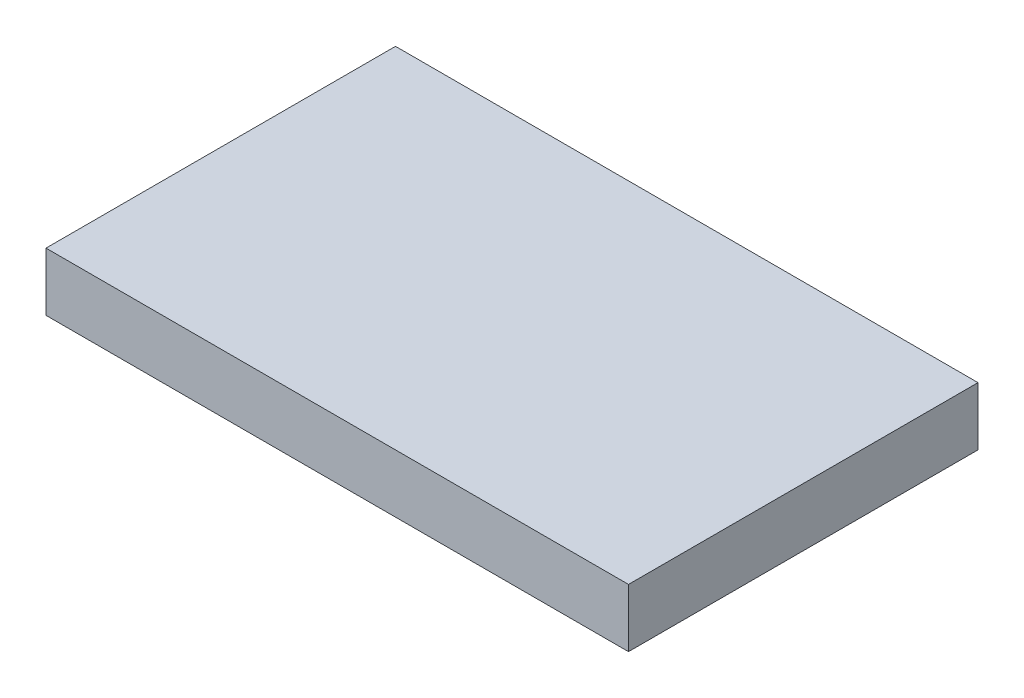
ISO-10303-21;
HEADER;
FILE_DESCRIPTION(('STEP AP214'),'2;1');
FILE_NAME('part.step','',(''),(''),'','','');
FILE_SCHEMA(('AUTOMOTIVE_DESIGN { 1 0 10303 214 1 1 1 1 }'));
ENDSEC;
DATA;
#1=APPLICATION_CONTEXT('core data for automotive mechanical design processes');
#2=APPLICATION_PROTOCOL_DEFINITION('international standard','automotive_design',2000,#1);
#3=PRODUCT_CONTEXT('',#1,'mechanical');
#4=PRODUCT('Part','Part','',(#3));
#5=PRODUCT_RELATED_PRODUCT_CATEGORY('part','',(#4));
#6=PRODUCT_DEFINITION_FORMATION('','',#4);
#7=PRODUCT_DEFINITION_CONTEXT('part definition',#1,'design');
#8=PRODUCT_DEFINITION('design','',#6,#7);
#9=PRODUCT_DEFINITION_SHAPE('','',#8);
#10=(LENGTH_UNIT() NAMED_UNIT(*) SI_UNIT(.MILLI.,.METRE.));
#11=(NAMED_UNIT(*) PLANE_ANGLE_UNIT() SI_UNIT($,.RADIAN.));
#12=(NAMED_UNIT(*) SI_UNIT($,.STERADIAN.) SOLID_ANGLE_UNIT());
#13=UNCERTAINTY_MEASURE_WITH_UNIT(LENGTH_MEASURE(1.E-05),#10,'distance_accuracy_value','');
#14=(GEOMETRIC_REPRESENTATION_CONTEXT(3) GLOBAL_UNCERTAINTY_ASSIGNED_CONTEXT((#13)) GLOBAL_UNIT_ASSIGNED_CONTEXT((#10,
#11,#12)) REPRESENTATION_CONTEXT('',''));
#15=CARTESIAN_POINT('',(0.,0.,0.));
#16=DIRECTION('',(0.,0.,1.));
#17=DIRECTION('',(1.,0.,0.));
#18=AXIS2_PLACEMENT_3D('',#15,#16,#17);
#19=CARTESIAN_POINT('',(0.,2.,0.));
#20=DIRECTION('',(1.,0.,0.));
#21=DIRECTION('',(0.,0.,-1.));
#22=AXIS2_PLACEMENT_3D('',#19,#20,#21);
#23=PLANE('',#22);
#24=DIRECTION('',(0.,0.,1.));
#25=VECTOR('',#24,1.);
#26=CARTESIAN_POINT('',(0.,0.,0.));
#27=LINE('',#26,#25);
#28=CARTESIAN_POINT('',(0.,0.,0.));
#29=VERTEX_POINT('',#28);
#30=CARTESIAN_POINT('',(0.,0.,12.));
#31=VERTEX_POINT('',#30);
#32=EDGE_CURVE('E107',#29,#31,#27,.T.);
#33=ORIENTED_EDGE('',*,*,#32,.T.);
#34=DIRECTION('',(0.,-1.,0.));
#35=VECTOR('',#34,1.);
#36=CARTESIAN_POINT('',(0.,2.,12.));
#37=LINE('',#36,#35);
#38=CARTESIAN_POINT('',(0.,2.,12.));
#39=VERTEX_POINT('',#38);
#40=EDGE_CURVE('E11',#39,#31,#37,.T.);
#41=ORIENTED_EDGE('',*,*,#40,.F.);
#42=DIRECTION('',(0.,0.,1.));
#43=VECTOR('',#42,1.);
#44=CARTESIAN_POINT('',(0.,2.,0.));
#45=LINE('',#44,#43);
#46=CARTESIAN_POINT('',(0.,2.,0.));
#47=VERTEX_POINT('',#46);
#48=EDGE_CURVE('E91',#47,#39,#45,.T.);
#49=ORIENTED_EDGE('',*,*,#48,.F.);
#50=DIRECTION('',(0.,-1.,0.));
#51=VECTOR('',#50,1.);
#52=CARTESIAN_POINT('',(0.,2.,0.));
#53=LINE('',#52,#51);
#54=EDGE_CURVE('E103',#47,#29,#53,.T.);
#55=ORIENTED_EDGE('',*,*,#54,.T.);
#56=EDGE_LOOP('',(#33,#41,#49,#55));
#57=FACE_BOUND('',#56,.T.);
#58=ADVANCED_FACE('F39',(#57),#23,.F.);
#59=CARTESIAN_POINT('',(0.,2.,12.));
#60=DIRECTION('',(0.,0.,-1.));
#61=DIRECTION('',(-1.,0.,0.));
#62=AXIS2_PLACEMENT_3D('',#59,#60,#61);
#63=PLANE('',#62);
#64=DIRECTION('',(1.,0.,0.));
#65=VECTOR('',#64,1.);
#66=CARTESIAN_POINT('',(0.,0.,12.));
#67=LINE('',#66,#65);
#68=CARTESIAN_POINT('',(20.,0.,12.));
#69=VERTEX_POINT('',#68);
#70=EDGE_CURVE('E96',#31,#69,#67,.T.);
#71=ORIENTED_EDGE('',*,*,#70,.T.);
#72=DIRECTION('',(0.,-1.,0.));
#73=VECTOR('',#72,1.);
#74=CARTESIAN_POINT('',(20.,2.,12.));
#75=LINE('',#74,#73);
#76=CARTESIAN_POINT('',(20.,2.,12.));
#77=VERTEX_POINT('',#76);
#78=EDGE_CURVE('E48',#77,#69,#75,.T.);
#79=ORIENTED_EDGE('',*,*,#78,.F.);
#80=DIRECTION('',(1.,0.,0.));
#81=VECTOR('',#80,1.);
#82=CARTESIAN_POINT('',(0.,2.,12.));
#83=LINE('',#82,#81);
#84=EDGE_CURVE('E86',#39,#77,#83,.T.);
#85=ORIENTED_EDGE('',*,*,#84,.F.);
#86=ORIENTED_EDGE('',*,*,#40,.T.);
#87=EDGE_LOOP('',(#71,#79,#85,#86));
#88=FACE_BOUND('',#87,.T.);
#89=ADVANCED_FACE('F95',(#88),#63,.F.);
#90=CARTESIAN_POINT('',(20.,2.,0.));
#91=DIRECTION('',(-1.,0.,0.));
#92=DIRECTION('',(0.,0.,1.));
#93=AXIS2_PLACEMENT_3D('',#90,#91,#92);
#94=PLANE('',#93);
#95=DIRECTION('',(0.,0.,-1.));
#96=VECTOR('',#95,1.);
#97=CARTESIAN_POINT('',(20.,0.,0.));
#98=LINE('',#97,#96);
#99=CARTESIAN_POINT('',(20.,0.,0.));
#100=VERTEX_POINT('',#99);
#101=EDGE_CURVE('E73',#69,#100,#98,.T.);
#102=ORIENTED_EDGE('',*,*,#101,.T.);
#103=DIRECTION('',(0.,-1.,0.));
#104=VECTOR('',#103,1.);
#105=CARTESIAN_POINT('',(20.,2.,0.));
#106=LINE('',#105,#104);
#107=CARTESIAN_POINT('',(20.,2.,0.));
#108=VERTEX_POINT('',#107);
#109=EDGE_CURVE('E98',#108,#100,#106,.T.);
#110=ORIENTED_EDGE('',*,*,#109,.F.);
#111=DIRECTION('',(0.,0.,-1.));
#112=VECTOR('',#111,1.);
#113=CARTESIAN_POINT('',(20.,2.,0.));
#114=LINE('',#113,#112);
#115=EDGE_CURVE('E89',#77,#108,#114,.T.);
#116=ORIENTED_EDGE('',*,*,#115,.F.);
#117=ORIENTED_EDGE('',*,*,#78,.T.);
#118=EDGE_LOOP('',(#102,#110,#116,#117));
#119=FACE_BOUND('',#118,.T.);
#120=ADVANCED_FACE('F99',(#119),#94,.F.);
#121=CARTESIAN_POINT('',(0.,2.,0.));
#122=DIRECTION('',(0.,0.,1.));
#123=DIRECTION('',(1.,0.,0.));
#124=AXIS2_PLACEMENT_3D('',#121,#122,#123);
#125=PLANE('',#124);
#126=DIRECTION('',(-1.,0.,0.));
#127=VECTOR('',#126,1.);
#128=CARTESIAN_POINT('',(0.,0.,0.));
#129=LINE('',#128,#127);
#130=EDGE_CURVE('E79',#100,#29,#129,.T.);
#131=ORIENTED_EDGE('',*,*,#130,.T.);
#132=ORIENTED_EDGE('',*,*,#54,.F.);
#133=DIRECTION('',(-1.,0.,0.));
#134=VECTOR('',#133,1.);
#135=CARTESIAN_POINT('',(0.,2.,0.));
#136=LINE('',#135,#134);
#137=EDGE_CURVE('E56',#108,#47,#136,.T.);
#138=ORIENTED_EDGE('',*,*,#137,.F.);
#139=ORIENTED_EDGE('',*,*,#109,.T.);
#140=EDGE_LOOP('',(#131,#132,#138,#139));
#141=FACE_BOUND('',#140,.T.);
#142=ADVANCED_FACE('F120',(#141),#125,.F.);
#143=CARTESIAN_POINT('',(0.,2.,0.));
#144=DIRECTION('',(0.,1.,0.));
#145=DIRECTION('',(0.,0.,1.));
#146=AXIS2_PLACEMENT_3D('',#143,#144,#145);
#147=PLANE('',#146);
#148=ORIENTED_EDGE('',*,*,#48,.T.);
#149=ORIENTED_EDGE('',*,*,#84,.T.);
#150=ORIENTED_EDGE('',*,*,#115,.T.);
#151=ORIENTED_EDGE('',*,*,#137,.T.);
#152=EDGE_LOOP('',(#148,#149,#150,#151));
#153=FACE_BOUND('',#152,.T.);
#154=ADVANCED_FACE('F87',(#153),#147,.T.);
#155=CARTESIAN_POINT('',(0.,0.,0.));
#156=DIRECTION('',(0.,1.,0.));
#157=DIRECTION('',(0.,0.,1.));
#158=AXIS2_PLACEMENT_3D('',#155,#156,#157);
#159=PLANE('',#158);
#160=ORIENTED_EDGE('',*,*,#32,.F.);
#161=ORIENTED_EDGE('',*,*,#130,.F.);
#162=ORIENTED_EDGE('',*,*,#101,.F.);
#163=ORIENTED_EDGE('',*,*,#70,.F.);
#164=EDGE_LOOP('',(#160,#161,#162,#163));
#165=FACE_BOUND('',#164,.T.);
#166=ADVANCED_FACE('F123',(#165),#159,.F.);
#167=CLOSED_SHELL('',(#58,#89,#120,#142,#154,#166));
#168=MANIFOLD_SOLID_BREP('B2',#167);
#169=ADVANCED_BREP_SHAPE_REPRESENTATION('',(#18,#168),#14);
#170=SHAPE_DEFINITION_REPRESENTATION(#9,#169);
ENDSEC;
END-ISO-10303-21;
